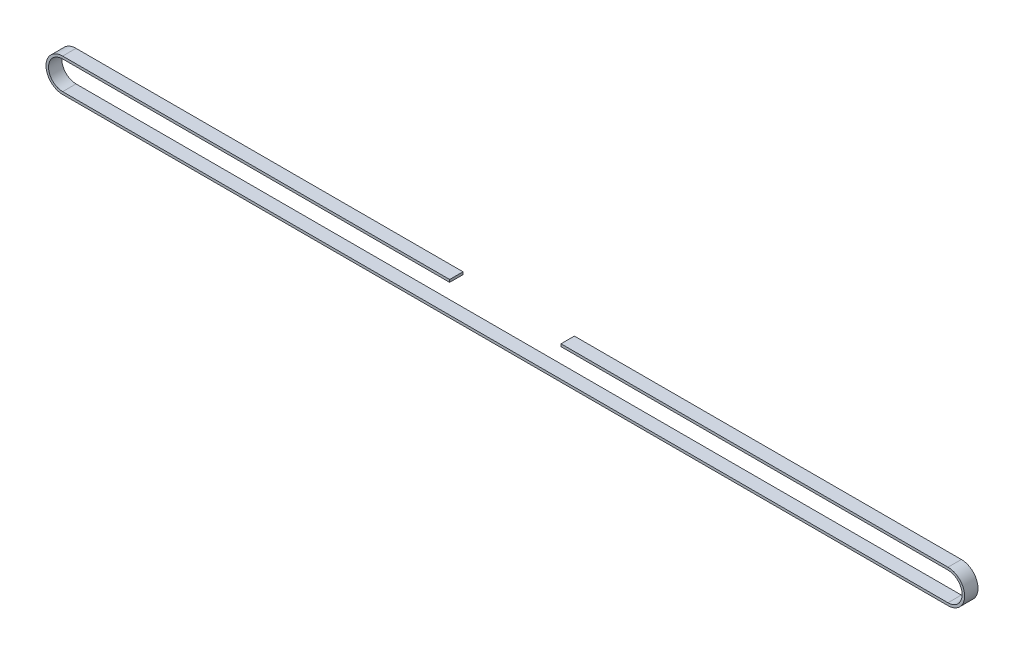
ISO-10303-21;
HEADER;
FILE_DESCRIPTION(('STEP AP214'),'2;1');
FILE_NAME('part.step','',(''),(''),'','','');
FILE_SCHEMA(('AUTOMOTIVE_DESIGN { 1 0 10303 214 1 1 1 1 }'));
ENDSEC;
DATA;
#1=APPLICATION_CONTEXT('core data for automotive mechanical design processes');
#2=APPLICATION_PROTOCOL_DEFINITION('international standard','automotive_design',2000,#1);
#3=PRODUCT_CONTEXT('',#1,'mechanical');
#4=PRODUCT('Part','Part','',(#3));
#5=PRODUCT_RELATED_PRODUCT_CATEGORY('part','',(#4));
#6=PRODUCT_DEFINITION_FORMATION('','',#4);
#7=PRODUCT_DEFINITION_CONTEXT('part definition',#1,'design');
#8=PRODUCT_DEFINITION('design','',#6,#7);
#9=PRODUCT_DEFINITION_SHAPE('','',#8);
#10=(LENGTH_UNIT() NAMED_UNIT(*) SI_UNIT(.MILLI.,.METRE.));
#11=(NAMED_UNIT(*) PLANE_ANGLE_UNIT() SI_UNIT($,.RADIAN.));
#12=(NAMED_UNIT(*) SI_UNIT($,.STERADIAN.) SOLID_ANGLE_UNIT());
#13=UNCERTAINTY_MEASURE_WITH_UNIT(LENGTH_MEASURE(1.E-05),#10,'distance_accuracy_value','');
#14=(GEOMETRIC_REPRESENTATION_CONTEXT(3) GLOBAL_UNCERTAINTY_ASSIGNED_CONTEXT((#13)) GLOBAL_UNIT_ASSIGNED_CONTEXT((#10,
#11,#12)) REPRESENTATION_CONTEXT('',''));
#15=CARTESIAN_POINT('',(0.,0.,0.));
#16=DIRECTION('',(0.,0.,1.));
#17=DIRECTION('',(1.,0.,0.));
#18=AXIS2_PLACEMENT_3D('',#15,#16,#17);
#19=CARTESIAN_POINT('',(-198.75,7.48,3.));
#20=DIRECTION('',(0.,-1.,0.));
#21=DIRECTION('',(0.,0.,-1.));
#22=AXIS2_PLACEMENT_3D('',#19,#20,#21);
#23=PLANE('',#22);
#24=DIRECTION('',(-1.,0.,0.));
#25=VECTOR('',#24,1.);
#26=CARTESIAN_POINT('',(-198.75,7.48,3.));
#27=LINE('',#26,#25);
#28=CARTESIAN_POINT('',(-25.,7.48,3.));
#29=VERTEX_POINT('',#28);
#30=CARTESIAN_POINT('',(-198.75,7.48,3.));
#31=VERTEX_POINT('',#30);
#32=EDGE_CURVE('E161',#29,#31,#27,.T.);
#33=ORIENTED_EDGE('',*,*,#32,.F.);
#34=DIRECTION('',(0.,0.,1.));
#35=VECTOR('',#34,1.);
#36=CARTESIAN_POINT('',(-25.,7.48,-10.));
#37=LINE('',#36,#35);
#38=CARTESIAN_POINT('',(-25.,7.48,-3.));
#39=VERTEX_POINT('',#38);
#40=EDGE_CURVE('E201',#39,#29,#37,.T.);
#41=ORIENTED_EDGE('',*,*,#40,.F.);
#42=DIRECTION('',(-1.,0.,0.));
#43=VECTOR('',#42,1.);
#44=CARTESIAN_POINT('',(-198.75,7.48,-3.));
#45=LINE('',#44,#43);
#46=CARTESIAN_POINT('',(-198.75,7.48,-3.));
#47=VERTEX_POINT('',#46);
#48=EDGE_CURVE('E168',#39,#47,#45,.T.);
#49=ORIENTED_EDGE('',*,*,#48,.T.);
#50=DIRECTION('',(0.,0.,-1.));
#51=VECTOR('',#50,1.);
#52=CARTESIAN_POINT('',(-198.75,7.48,3.));
#53=LINE('',#52,#51);
#54=EDGE_CURVE('E162',#31,#47,#53,.T.);
#55=ORIENTED_EDGE('',*,*,#54,.F.);
#56=EDGE_LOOP('',(#33,#41,#49,#55));
#57=FACE_BOUND('',#56,.T.);
#58=ADVANCED_FACE('F17',(#57),#23,.F.);
#59=CARTESIAN_POINT('',(-198.75,6.35,3.));
#60=DIRECTION('',(0.,-1.,0.));
#61=DIRECTION('',(1.,0.,0.));
#62=AXIS2_PLACEMENT_3D('',#59,#60,#61);
#63=PLANE('',#62);
#64=DIRECTION('',(0.,0.,-1.));
#65=VECTOR('',#64,1.);
#66=CARTESIAN_POINT('',(-25.,6.35,3.));
#67=LINE('',#66,#65);
#68=CARTESIAN_POINT('',(-25.,6.35,3.));
#69=VERTEX_POINT('',#68);
#70=CARTESIAN_POINT('',(-25.,6.35,-3.));
#71=VERTEX_POINT('',#70);
#72=EDGE_CURVE('E11',#69,#71,#67,.T.);
#73=ORIENTED_EDGE('',*,*,#72,.F.);
#74=DIRECTION('',(-1.,0.,0.));
#75=VECTOR('',#74,1.);
#76=CARTESIAN_POINT('',(-198.75,6.35,3.));
#77=LINE('',#76,#75);
#78=CARTESIAN_POINT('',(-198.75,6.35,3.));
#79=VERTEX_POINT('',#78);
#80=EDGE_CURVE('E123',#69,#79,#77,.T.);
#81=ORIENTED_EDGE('',*,*,#80,.T.);
#82=DIRECTION('',(0.,0.,-1.));
#83=VECTOR('',#82,1.);
#84=CARTESIAN_POINT('',(-198.75,6.35,3.));
#85=LINE('',#84,#83);
#86=CARTESIAN_POINT('',(-198.75,6.35,-3.));
#87=VERTEX_POINT('',#86);
#88=EDGE_CURVE('E121',#79,#87,#85,.T.);
#89=ORIENTED_EDGE('',*,*,#88,.T.);
#90=DIRECTION('',(-1.,0.,0.));
#91=VECTOR('',#90,1.);
#92=CARTESIAN_POINT('',(-198.75,6.35,-3.));
#93=LINE('',#92,#91);
#94=EDGE_CURVE('E142',#71,#87,#93,.T.);
#95=ORIENTED_EDGE('',*,*,#94,.F.);
#96=EDGE_LOOP('',(#73,#81,#89,#95));
#97=FACE_BOUND('',#96,.T.);
#98=ADVANCED_FACE('F227',(#97),#63,.T.);
#99=CARTESIAN_POINT('',(-198.75,0.,3.));
#100=DIRECTION('',(0.,0.,1.));
#101=DIRECTION('',(1.,0.,0.));
#102=AXIS2_PLACEMENT_3D('',#99,#100,#101);
#103=PLANE('',#102);
#104=DIRECTION('',(0.,-1.,0.));
#105=VECTOR('',#104,1.);
#106=CARTESIAN_POINT('',(-25.,0.,3.));
#107=LINE('',#106,#105);
#108=EDGE_CURVE('E33',#29,#69,#107,.T.);
#109=ORIENTED_EDGE('',*,*,#108,.F.);
#110=ORIENTED_EDGE('',*,*,#32,.T.);
#111=CARTESIAN_POINT('',(-198.75,0.,3.));
#112=DIRECTION('',(0.,0.,1.));
#113=DIRECTION('',(1.,0.,0.));
#114=AXIS2_PLACEMENT_3D('',#111,#112,#113);
#115=CIRCLE('',#114,7.48);
#116=CARTESIAN_POINT('',(-198.75,-7.48,3.));
#117=VERTEX_POINT('',#116);
#118=EDGE_CURVE('E153',#31,#117,#115,.T.);
#119=ORIENTED_EDGE('',*,*,#118,.T.);
#120=DIRECTION('',(1.,0.,0.));
#121=VECTOR('',#120,1.);
#122=CARTESIAN_POINT('',(-198.75,-7.48,3.));
#123=LINE('',#122,#121);
#124=CARTESIAN_POINT('',(198.75,-7.47999999999989,3.));
#125=VERTEX_POINT('',#124);
#126=EDGE_CURVE('E156',#117,#125,#123,.T.);
#127=ORIENTED_EDGE('',*,*,#126,.T.);
#128=CARTESIAN_POINT('',(198.75,0.,3.));
#129=DIRECTION('',(0.,0.,1.));
#130=DIRECTION('',(1.,0.,0.));
#131=AXIS2_PLACEMENT_3D('',#128,#129,#130);
#132=CIRCLE('',#131,7.48);
#133=CARTESIAN_POINT('',(198.75,7.48,3.));
#134=VERTEX_POINT('',#133);
#135=EDGE_CURVE('E157',#125,#134,#132,.T.);
#136=ORIENTED_EDGE('',*,*,#135,.T.);
#137=CARTESIAN_POINT('',(25.,7.48,3.));
#138=VERTEX_POINT('',#137);
#139=EDGE_CURVE('E119',#134,#138,#27,.T.);
#140=ORIENTED_EDGE('',*,*,#139,.T.);
#141=DIRECTION('',(0.,1.,0.));
#142=VECTOR('',#141,1.);
#143=CARTESIAN_POINT('',(25.,0.,3.));
#144=LINE('',#143,#142);
#145=CARTESIAN_POINT('',(25.,6.35,3.));
#146=VERTEX_POINT('',#145);
#147=EDGE_CURVE('E102',#146,#138,#144,.T.);
#148=ORIENTED_EDGE('',*,*,#147,.F.);
#149=CARTESIAN_POINT('',(198.75,6.35000000000007,3.));
#150=VERTEX_POINT('',#149);
#151=EDGE_CURVE('E116',#150,#146,#77,.T.);
#152=ORIENTED_EDGE('',*,*,#151,.F.);
#153=CARTESIAN_POINT('',(198.75,0.,3.));
#154=DIRECTION('',(0.,0.,1.));
#155=DIRECTION('',(1.,0.,0.));
#156=AXIS2_PLACEMENT_3D('',#153,#154,#155);
#157=CIRCLE('',#156,6.35);
#158=CARTESIAN_POINT('',(198.75,-6.34999999999993,3.));
#159=VERTEX_POINT('',#158);
#160=EDGE_CURVE('E127',#159,#150,#157,.T.);
#161=ORIENTED_EDGE('',*,*,#160,.F.);
#162=DIRECTION('',(1.,0.,0.));
#163=VECTOR('',#162,1.);
#164=CARTESIAN_POINT('',(-198.75,-6.35,3.));
#165=LINE('',#164,#163);
#166=CARTESIAN_POINT('',(-198.75,-6.35,3.));
#167=VERTEX_POINT('',#166);
#168=EDGE_CURVE('E209',#167,#159,#165,.T.);
#169=ORIENTED_EDGE('',*,*,#168,.F.);
#170=CARTESIAN_POINT('',(-198.75,0.,3.));
#171=DIRECTION('',(0.,0.,1.));
#172=DIRECTION('',(1.,0.,0.));
#173=AXIS2_PLACEMENT_3D('',#170,#171,#172);
#174=CIRCLE('',#173,6.35);
#175=EDGE_CURVE('E145',#79,#167,#174,.T.);
#176=ORIENTED_EDGE('',*,*,#175,.F.);
#177=ORIENTED_EDGE('',*,*,#80,.F.);
#178=EDGE_LOOP('',(#109,#110,#119,#127,#136,#140,#148,#152,#161,#169,#176,#177));
#179=FACE_BOUND('',#178,.T.);
#180=ADVANCED_FACE('F111',(#179),#103,.T.);
#181=CARTESIAN_POINT('',(-198.75,0.,-3.));
#182=DIRECTION('',(0.,0.,1.));
#183=DIRECTION('',(1.,0.,0.));
#184=AXIS2_PLACEMENT_3D('',#181,#182,#183);
#185=PLANE('',#184);
#186=ORIENTED_EDGE('',*,*,#48,.F.);
#187=DIRECTION('',(0.,-1.,0.));
#188=VECTOR('',#187,1.);
#189=CARTESIAN_POINT('',(-25.,0.,-3.));
#190=LINE('',#189,#188);
#191=EDGE_CURVE('E118',#39,#71,#190,.T.);
#192=ORIENTED_EDGE('',*,*,#191,.T.);
#193=ORIENTED_EDGE('',*,*,#94,.T.);
#194=CARTESIAN_POINT('',(-198.75,0.,-3.));
#195=DIRECTION('',(0.,0.,1.));
#196=DIRECTION('',(1.,0.,0.));
#197=AXIS2_PLACEMENT_3D('',#194,#195,#196);
#198=CIRCLE('',#197,6.35);
#199=CARTESIAN_POINT('',(-198.75,-6.35,-3.));
#200=VERTEX_POINT('',#199);
#201=EDGE_CURVE('E132',#87,#200,#198,.T.);
#202=ORIENTED_EDGE('',*,*,#201,.T.);
#203=DIRECTION('',(1.,0.,0.));
#204=VECTOR('',#203,1.);
#205=CARTESIAN_POINT('',(-198.75,-6.35,-3.));
#206=LINE('',#205,#204);
#207=CARTESIAN_POINT('',(198.75,-6.34999999999993,-3.));
#208=VERTEX_POINT('',#207);
#209=EDGE_CURVE('E136',#200,#208,#206,.T.);
#210=ORIENTED_EDGE('',*,*,#209,.T.);
#211=CARTESIAN_POINT('',(198.75,0.,-3.));
#212=DIRECTION('',(0.,0.,1.));
#213=DIRECTION('',(1.,0.,0.));
#214=AXIS2_PLACEMENT_3D('',#211,#212,#213);
#215=CIRCLE('',#214,6.35);
#216=CARTESIAN_POINT('',(198.75,6.35000000000007,-3.));
#217=VERTEX_POINT('',#216);
#218=EDGE_CURVE('E137',#208,#217,#215,.T.);
#219=ORIENTED_EDGE('',*,*,#218,.T.);
#220=CARTESIAN_POINT('',(25.,6.35,-3.));
#221=VERTEX_POINT('',#220);
#222=EDGE_CURVE('E141',#217,#221,#93,.T.);
#223=ORIENTED_EDGE('',*,*,#222,.T.);
#224=DIRECTION('',(0.,1.,0.));
#225=VECTOR('',#224,1.);
#226=CARTESIAN_POINT('',(25.,0.,-3.));
#227=LINE('',#226,#225);
#228=CARTESIAN_POINT('',(25.,7.48,-3.));
#229=VERTEX_POINT('',#228);
#230=EDGE_CURVE('E39',#221,#229,#227,.T.);
#231=ORIENTED_EDGE('',*,*,#230,.T.);
#232=CARTESIAN_POINT('',(198.75,7.48,-3.));
#233=VERTEX_POINT('',#232);
#234=EDGE_CURVE('E160',#233,#229,#45,.T.);
#235=ORIENTED_EDGE('',*,*,#234,.F.);
#236=CARTESIAN_POINT('',(198.75,0.,-3.));
#237=DIRECTION('',(0.,0.,1.));
#238=DIRECTION('',(1.,0.,0.));
#239=AXIS2_PLACEMENT_3D('',#236,#237,#238);
#240=CIRCLE('',#239,7.48);
#241=CARTESIAN_POINT('',(198.75,-7.47999999999989,-3.));
#242=VERTEX_POINT('',#241);
#243=EDGE_CURVE('E169',#242,#233,#240,.T.);
#244=ORIENTED_EDGE('',*,*,#243,.F.);
#245=DIRECTION('',(1.,0.,0.));
#246=VECTOR('',#245,1.);
#247=CARTESIAN_POINT('',(-198.75,-7.48,-3.));
#248=LINE('',#247,#246);
#249=CARTESIAN_POINT('',(-198.75,-7.48,-3.));
#250=VERTEX_POINT('',#249);
#251=EDGE_CURVE('E167',#250,#242,#248,.T.);
#252=ORIENTED_EDGE('',*,*,#251,.F.);
#253=CARTESIAN_POINT('',(-198.75,0.,-3.));
#254=DIRECTION('',(0.,0.,1.));
#255=DIRECTION('',(1.,0.,0.));
#256=AXIS2_PLACEMENT_3D('',#253,#254,#255);
#257=CIRCLE('',#256,7.48);
#258=EDGE_CURVE('E155',#47,#250,#257,.T.);
#259=ORIENTED_EDGE('',*,*,#258,.F.);
#260=EDGE_LOOP('',(#186,#192,#193,#202,#210,#219,#223,#231,#235,#244,#252,#259));
#261=FACE_BOUND('',#260,.T.);
#262=ADVANCED_FACE('F195',(#261),#185,.F.);
#263=CARTESIAN_POINT('',(-198.75,0.,3.));
#264=DIRECTION('',(0.,0.,-1.));
#265=DIRECTION('',(-1.,0.,0.));
#266=AXIS2_PLACEMENT_3D('',#263,#264,#265);
#267=CYLINDRICAL_SURFACE('',#266,7.48);
#268=ORIENTED_EDGE('',*,*,#258,.T.);
#269=DIRECTION('',(0.,0.,-1.));
#270=VECTOR('',#269,1.);
#271=CARTESIAN_POINT('',(-198.75,-7.48,3.));
#272=LINE('',#271,#270);
#273=EDGE_CURVE('E109',#117,#250,#272,.T.);
#274=ORIENTED_EDGE('',*,*,#273,.F.);
#275=ORIENTED_EDGE('',*,*,#118,.F.);
#276=ORIENTED_EDGE('',*,*,#54,.T.);
#277=EDGE_LOOP('',(#268,#274,#275,#276));
#278=FACE_BOUND('',#277,.T.);
#279=ADVANCED_FACE('F19',(#278),#267,.T.);
#280=CARTESIAN_POINT('',(-198.75,-7.48,3.));
#281=DIRECTION('',(0.,1.,0.));
#282=DIRECTION('',(-1.,0.,0.));
#283=AXIS2_PLACEMENT_3D('',#280,#281,#282);
#284=PLANE('',#283);
#285=ORIENTED_EDGE('',*,*,#251,.T.);
#286=DIRECTION('',(0.,0.,-1.));
#287=VECTOR('',#286,1.);
#288=CARTESIAN_POINT('',(198.75,-7.47999999999989,3.));
#289=LINE('',#288,#287);
#290=EDGE_CURVE('E179',#125,#242,#289,.T.);
#291=ORIENTED_EDGE('',*,*,#290,.F.);
#292=ORIENTED_EDGE('',*,*,#126,.F.);
#293=ORIENTED_EDGE('',*,*,#273,.T.);
#294=EDGE_LOOP('',(#285,#291,#292,#293));
#295=FACE_BOUND('',#294,.T.);
#296=ADVANCED_FACE('F182',(#295),#284,.F.);
#297=CARTESIAN_POINT('',(198.75,0.,3.));
#298=DIRECTION('',(0.,0.,-1.));
#299=DIRECTION('',(-1.,0.,0.));
#300=AXIS2_PLACEMENT_3D('',#297,#298,#299);
#301=CYLINDRICAL_SURFACE('',#300,7.48);
#302=ORIENTED_EDGE('',*,*,#243,.T.);
#303=DIRECTION('',(0.,0.,-1.));
#304=VECTOR('',#303,1.);
#305=CARTESIAN_POINT('',(198.75,7.48,3.));
#306=LINE('',#305,#304);
#307=EDGE_CURVE('E175',#134,#233,#306,.T.);
#308=ORIENTED_EDGE('',*,*,#307,.F.);
#309=ORIENTED_EDGE('',*,*,#135,.F.);
#310=ORIENTED_EDGE('',*,*,#290,.T.);
#311=EDGE_LOOP('',(#302,#308,#309,#310));
#312=FACE_BOUND('',#311,.T.);
#313=ADVANCED_FACE('F196',(#312),#301,.T.);
#314=ORIENTED_EDGE('',*,*,#234,.T.);
#315=DIRECTION('',(0.,0.,-1.));
#316=VECTOR('',#315,1.);
#317=CARTESIAN_POINT('',(25.,7.48,-10.));
#318=LINE('',#317,#316);
#319=EDGE_CURVE('E205',#138,#229,#318,.T.);
#320=ORIENTED_EDGE('',*,*,#319,.F.);
#321=ORIENTED_EDGE('',*,*,#139,.F.);
#322=ORIENTED_EDGE('',*,*,#307,.T.);
#323=EDGE_LOOP('',(#314,#320,#321,#322));
#324=FACE_BOUND('',#323,.T.);
#325=ADVANCED_FACE('F203',(#324),#23,.F.);
#326=CARTESIAN_POINT('',(-198.75,0.,3.));
#327=DIRECTION('',(0.,0.,-1.));
#328=DIRECTION('',(-1.,0.,0.));
#329=AXIS2_PLACEMENT_3D('',#326,#327,#328);
#330=CYLINDRICAL_SURFACE('',#329,6.35);
#331=ORIENTED_EDGE('',*,*,#201,.F.);
#332=ORIENTED_EDGE('',*,*,#88,.F.);
#333=ORIENTED_EDGE('',*,*,#175,.T.);
#334=DIRECTION('',(0.,0.,-1.));
#335=VECTOR('',#334,1.);
#336=CARTESIAN_POINT('',(-198.75,-6.35,3.));
#337=LINE('',#336,#335);
#338=EDGE_CURVE('E149',#167,#200,#337,.T.);
#339=ORIENTED_EDGE('',*,*,#338,.T.);
#340=EDGE_LOOP('',(#331,#332,#333,#339));
#341=FACE_BOUND('',#340,.T.);
#342=ADVANCED_FACE('F224',(#341),#330,.F.);
#343=CARTESIAN_POINT('',(-198.75,-6.35,3.));
#344=DIRECTION('',(0.,1.,0.));
#345=DIRECTION('',(-1.,0.,0.));
#346=AXIS2_PLACEMENT_3D('',#343,#344,#345);
#347=PLANE('',#346);
#348=ORIENTED_EDGE('',*,*,#209,.F.);
#349=ORIENTED_EDGE('',*,*,#338,.F.);
#350=ORIENTED_EDGE('',*,*,#168,.T.);
#351=DIRECTION('',(0.,0.,-1.));
#352=VECTOR('',#351,1.);
#353=CARTESIAN_POINT('',(198.75,-6.34999999999993,3.));
#354=LINE('',#353,#352);
#355=EDGE_CURVE('E150',#159,#208,#354,.T.);
#356=ORIENTED_EDGE('',*,*,#355,.T.);
#357=EDGE_LOOP('',(#348,#349,#350,#356));
#358=FACE_BOUND('',#357,.T.);
#359=ADVANCED_FACE('F221',(#358),#347,.T.);
#360=CARTESIAN_POINT('',(198.75,0.,3.));
#361=DIRECTION('',(0.,0.,-1.));
#362=DIRECTION('',(-1.,0.,0.));
#363=AXIS2_PLACEMENT_3D('',#360,#361,#362);
#364=CYLINDRICAL_SURFACE('',#363,6.35);
#365=ORIENTED_EDGE('',*,*,#218,.F.);
#366=ORIENTED_EDGE('',*,*,#355,.F.);
#367=ORIENTED_EDGE('',*,*,#160,.T.);
#368=DIRECTION('',(0.,0.,-1.));
#369=VECTOR('',#368,1.);
#370=CARTESIAN_POINT('',(198.75,6.35000000000007,3.));
#371=LINE('',#370,#369);
#372=EDGE_CURVE('E125',#150,#217,#371,.T.);
#373=ORIENTED_EDGE('',*,*,#372,.T.);
#374=EDGE_LOOP('',(#365,#366,#367,#373));
#375=FACE_BOUND('',#374,.T.);
#376=ADVANCED_FACE('F220',(#375),#364,.F.);
#377=DIRECTION('',(0.,0.,1.));
#378=VECTOR('',#377,1.);
#379=CARTESIAN_POINT('',(25.,6.35,3.));
#380=LINE('',#379,#378);
#381=EDGE_CURVE('E25',#221,#146,#380,.T.);
#382=ORIENTED_EDGE('',*,*,#381,.F.);
#383=ORIENTED_EDGE('',*,*,#222,.F.);
#384=ORIENTED_EDGE('',*,*,#372,.F.);
#385=ORIENTED_EDGE('',*,*,#151,.T.);
#386=EDGE_LOOP('',(#382,#383,#384,#385));
#387=FACE_BOUND('',#386,.T.);
#388=ADVANCED_FACE('F122',(#387),#63,.T.);
#389=CARTESIAN_POINT('',(25.,-47.501648071345,-10.));
#390=DIRECTION('',(1.,0.,0.));
#391=DIRECTION('',(0.,0.,-1.));
#392=AXIS2_PLACEMENT_3D('',#389,#390,#391);
#393=PLANE('',#392);
#394=ORIENTED_EDGE('',*,*,#147,.T.);
#395=ORIENTED_EDGE('',*,*,#319,.T.);
#396=ORIENTED_EDGE('',*,*,#230,.F.);
#397=ORIENTED_EDGE('',*,*,#381,.T.);
#398=EDGE_LOOP('',(#394,#395,#396,#397));
#399=FACE_BOUND('',#398,.T.);
#400=ADVANCED_FACE('F103',(#399),#393,.F.);
#401=CARTESIAN_POINT('',(-25.,-47.501648071345,-10.));
#402=DIRECTION('',(-1.,0.,0.));
#403=DIRECTION('',(0.,0.,1.));
#404=AXIS2_PLACEMENT_3D('',#401,#402,#403);
#405=PLANE('',#404);
#406=ORIENTED_EDGE('',*,*,#108,.T.);
#407=ORIENTED_EDGE('',*,*,#72,.T.);
#408=ORIENTED_EDGE('',*,*,#191,.F.);
#409=ORIENTED_EDGE('',*,*,#40,.T.);
#410=EDGE_LOOP('',(#406,#407,#408,#409));
#411=FACE_BOUND('',#410,.T.);
#412=ADVANCED_FACE('F229',(#411),#405,.F.);
#413=CLOSED_SHELL('',(#58,#98,#180,#262,#279,#296,#313,#325,#342,#359,#376,#388,#400,#412));
#414=MANIFOLD_SOLID_BREP('B1',#413);
#415=ADVANCED_BREP_SHAPE_REPRESENTATION('',(#18,#414),#14);
#416=SHAPE_DEFINITION_REPRESENTATION(#9,#415);
ENDSEC;
END-ISO-10303-21;
